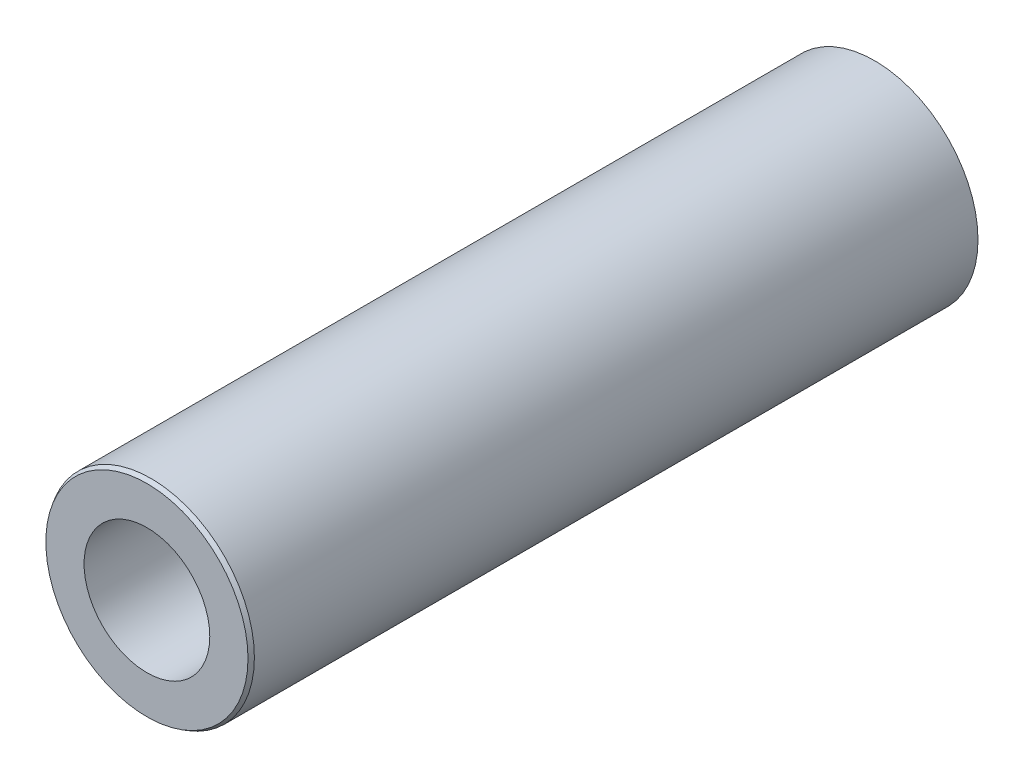
ISO-10303-21;
HEADER;
FILE_DESCRIPTION(('STEP AP214'),'2;1');
FILE_NAME('part.step','',(''),(''),'','','');
FILE_SCHEMA(('AUTOMOTIVE_DESIGN { 1 0 10303 214 1 1 1 1 }'));
ENDSEC;
DATA;
#1=APPLICATION_CONTEXT('core data for automotive mechanical design processes');
#2=APPLICATION_PROTOCOL_DEFINITION('international standard','automotive_design',2000,#1);
#3=PRODUCT_CONTEXT('',#1,'mechanical');
#4=PRODUCT('Part','Part','',(#3));
#5=PRODUCT_RELATED_PRODUCT_CATEGORY('part','',(#4));
#6=PRODUCT_DEFINITION_FORMATION('','',#4);
#7=PRODUCT_DEFINITION_CONTEXT('part definition',#1,'design');
#8=PRODUCT_DEFINITION('design','',#6,#7);
#9=PRODUCT_DEFINITION_SHAPE('','',#8);
#10=(LENGTH_UNIT() NAMED_UNIT(*) SI_UNIT(.MILLI.,.METRE.));
#11=(NAMED_UNIT(*) PLANE_ANGLE_UNIT() SI_UNIT($,.RADIAN.));
#12=(NAMED_UNIT(*) SI_UNIT($,.STERADIAN.) SOLID_ANGLE_UNIT());
#13=UNCERTAINTY_MEASURE_WITH_UNIT(LENGTH_MEASURE(1.E-05),#10,'distance_accuracy_value','');
#14=(GEOMETRIC_REPRESENTATION_CONTEXT(3) GLOBAL_UNCERTAINTY_ASSIGNED_CONTEXT((#13)) GLOBAL_UNIT_ASSIGNED_CONTEXT((#10,
#11,#12)) REPRESENTATION_CONTEXT('',''));
#15=CARTESIAN_POINT('',(0.,0.,0.));
#16=DIRECTION('',(0.,0.,1.));
#17=DIRECTION('',(1.,0.,0.));
#18=AXIS2_PLACEMENT_3D('',#15,#16,#17);
#19=CARTESIAN_POINT('',(33.,0.,18.));
#20=DIRECTION('',(0.,0.,-1.));
#21=DIRECTION('',(-1.,0.,0.));
#22=AXIS2_PLACEMENT_3D('',#19,#20,#21);
#23=CYLINDRICAL_SURFACE('',#22,2.55000000000001);
#24=CARTESIAN_POINT('',(33.,0.,17.9));
#25=DIRECTION('',(0.,0.,1.));
#26=DIRECTION('',(1.,0.,0.));
#27=AXIS2_PLACEMENT_3D('',#24,#25,#26);
#28=CIRCLE('',#27,2.55000000000001);
#29=CARTESIAN_POINT('',(35.55,0.,17.9));
#30=VERTEX_POINT('',#29);
#31=EDGE_CURVE('E47',#30,#30,#28,.F.);
#32=ORIENTED_EDGE('',*,*,#31,.T.);
#33=EDGE_LOOP('',(#32));
#34=FACE_BOUND('',#33,.T.);
#35=CARTESIAN_POINT('',(33.,0.,0.0577350269189598));
#36=DIRECTION('',(0.,0.,1.));
#37=DIRECTION('',(1.,0.,0.));
#38=AXIS2_PLACEMENT_3D('',#35,#36,#37);
#39=CIRCLE('',#38,2.55000000000001);
#40=CARTESIAN_POINT('',(35.55,0.,0.0577350269189598));
#41=VERTEX_POINT('',#40);
#42=EDGE_CURVE('E51',#41,#41,#39,.T.);
#43=ORIENTED_EDGE('',*,*,#42,.T.);
#44=EDGE_LOOP('',(#43));
#45=FACE_BOUND('',#44,.T.);
#46=ADVANCED_FACE('F39',(#34,#45),#23,.T.);
#47=CARTESIAN_POINT('',(33.,0.,18.));
#48=DIRECTION('',(0.,0.,1.));
#49=DIRECTION('',(1.,0.,0.));
#50=AXIS2_PLACEMENT_3D('',#47,#48,#49);
#51=PLANE('',#50);
#52=CARTESIAN_POINT('',(33.,0.,18.));
#53=DIRECTION('',(0.,0.,1.));
#54=DIRECTION('',(1.,0.,0.));
#55=AXIS2_PLACEMENT_3D('',#52,#53,#54);
#56=CIRCLE('',#55,2.49226497308105);
#57=CARTESIAN_POINT('',(35.492264973081,0.,18.));
#58=VERTEX_POINT('',#57);
#59=EDGE_CURVE('E55',#58,#58,#56,.T.);
#60=ORIENTED_EDGE('',*,*,#59,.T.);
#61=EDGE_LOOP('',(#60));
#62=FACE_BOUND('',#61,.T.);
#63=CARTESIAN_POINT('',(33.,0.,18.));
#64=DIRECTION('',(0.,0.,1.));
#65=DIRECTION('',(1.,0.,0.));
#66=AXIS2_PLACEMENT_3D('',#63,#64,#65);
#67=CIRCLE('',#66,1.55);
#68=CARTESIAN_POINT('',(34.55,0.,18.));
#69=VERTEX_POINT('',#68);
#70=EDGE_CURVE('E63',#69,#69,#67,.T.);
#71=ORIENTED_EDGE('',*,*,#70,.F.);
#72=EDGE_LOOP('',(#71));
#73=FACE_BOUND('',#72,.T.);
#74=ADVANCED_FACE('F70',(#62,#73),#51,.T.);
#75=CARTESIAN_POINT('',(33.,0.,0.));
#76=DIRECTION('',(0.,0.,1.));
#77=DIRECTION('',(1.,0.,0.));
#78=AXIS2_PLACEMENT_3D('',#75,#76,#77);
#79=PLANE('',#78);
#80=CARTESIAN_POINT('',(33.,0.,0.));
#81=DIRECTION('',(0.,0.,1.));
#82=DIRECTION('',(1.,0.,0.));
#83=AXIS2_PLACEMENT_3D('',#80,#81,#82);
#84=CIRCLE('',#83,2.45000000000001);
#85=CARTESIAN_POINT('',(35.45,0.,0.));
#86=VERTEX_POINT('',#85);
#87=EDGE_CURVE('E10',#86,#86,#84,.F.);
#88=ORIENTED_EDGE('',*,*,#87,.T.);
#89=EDGE_LOOP('',(#88));
#90=FACE_BOUND('',#89,.T.);
#91=CARTESIAN_POINT('',(33.,0.,0.));
#92=DIRECTION('',(0.,0.,1.));
#93=DIRECTION('',(1.,0.,0.));
#94=AXIS2_PLACEMENT_3D('',#91,#92,#93);
#95=CIRCLE('',#94,1.55);
#96=CARTESIAN_POINT('',(34.55,0.,0.));
#97=VERTEX_POINT('',#96);
#98=EDGE_CURVE('E60',#97,#97,#95,.F.);
#99=ORIENTED_EDGE('',*,*,#98,.F.);
#100=EDGE_LOOP('',(#99));
#101=FACE_BOUND('',#100,.T.);
#102=ADVANCED_FACE('F72',(#90,#101),#79,.F.);
#103=CARTESIAN_POINT('',(33.,0.,-0.001000000000001));
#104=DIRECTION('',(0.,0.,1.));
#105=DIRECTION('',(1.,0.,0.));
#106=AXIS2_PLACEMENT_3D('',#103,#104,#105);
#107=CYLINDRICAL_SURFACE('',#106,1.55);
#108=ORIENTED_EDGE('',*,*,#70,.T.);
#109=EDGE_LOOP('',(#108));
#110=FACE_BOUND('',#109,.T.);
#111=ORIENTED_EDGE('',*,*,#98,.T.);
#112=EDGE_LOOP('',(#111));
#113=FACE_BOUND('',#112,.T.);
#114=ADVANCED_FACE('F67',(#110,#113),#107,.F.);
#115=CARTESIAN_POINT('',(33.,0.,18.));
#116=DIRECTION('',(0.,0.,-1.));
#117=DIRECTION('',(-1.,0.,0.));
#118=AXIS2_PLACEMENT_3D('',#115,#116,#117);
#119=CONICAL_SURFACE('',#118,2.49226497308105,0.523598775598271);
#120=ORIENTED_EDGE('',*,*,#31,.F.);
#121=EDGE_LOOP('',(#120));
#122=FACE_BOUND('',#121,.T.);
#123=ORIENTED_EDGE('',*,*,#59,.F.);
#124=EDGE_LOOP('',(#123));
#125=FACE_BOUND('',#124,.T.);
#126=ADVANCED_FACE('F83',(#122,#125),#119,.T.);
#127=CARTESIAN_POINT('',(33.,0.,0.0577350269189598));
#128=DIRECTION('',(0.,0.,1.));
#129=DIRECTION('',(1.,0.,0.));
#130=AXIS2_PLACEMENT_3D('',#127,#128,#129);
#131=CONICAL_SURFACE('',#130,2.55000000000001,1.04719755119661);
#132=ORIENTED_EDGE('',*,*,#87,.F.);
#133=EDGE_LOOP('',(#132));
#134=FACE_BOUND('',#133,.T.);
#135=ORIENTED_EDGE('',*,*,#42,.F.);
#136=EDGE_LOOP('',(#135));
#137=FACE_BOUND('',#136,.T.);
#138=ADVANCED_FACE('F42',(#134,#137),#131,.T.);
#139=CLOSED_SHELL('',(#46,#74,#102,#114,#126,#138));
#140=MANIFOLD_SOLID_BREP('B2',#139);
#141=ADVANCED_BREP_SHAPE_REPRESENTATION('',(#18,#140),#14);
#142=SHAPE_DEFINITION_REPRESENTATION(#9,#141);
ENDSEC;
END-ISO-10303-21;
